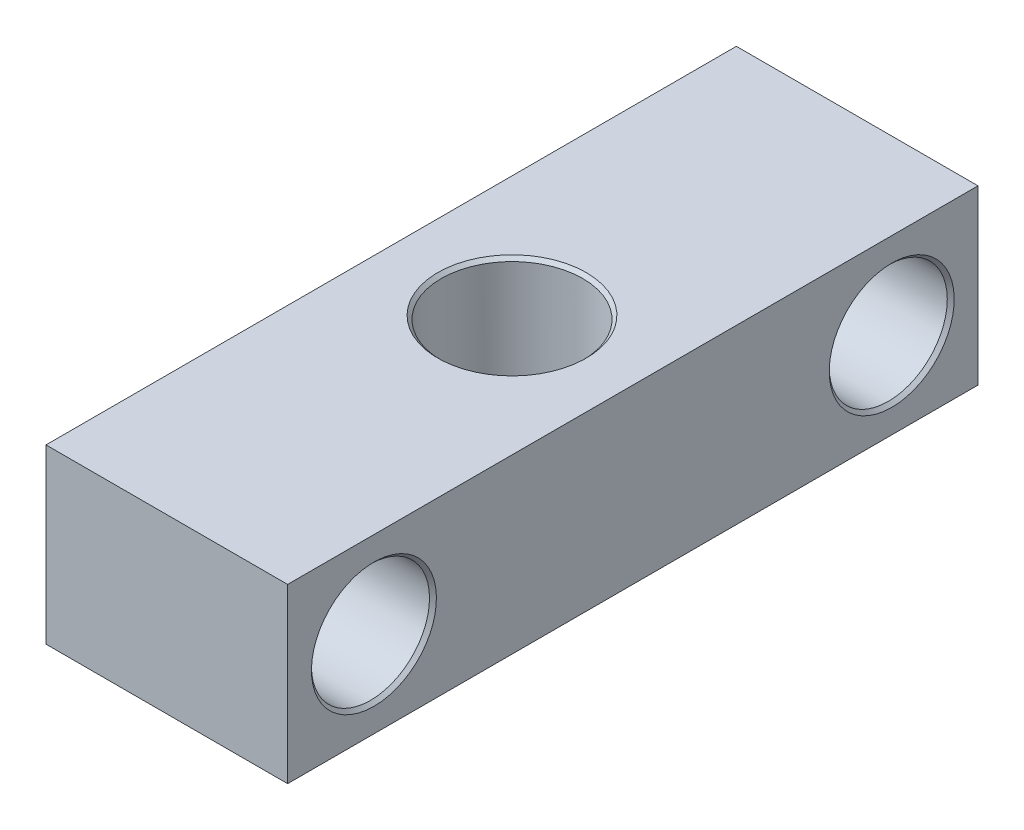
ISO-10303-21;
HEADER;
FILE_DESCRIPTION(('STEP AP214'),'2;1');
FILE_NAME('part.step','',(''),(''),'','','');
FILE_SCHEMA(('AUTOMOTIVE_DESIGN { 1 0 10303 214 1 1 1 1 }'));
ENDSEC;
DATA;
#1=APPLICATION_CONTEXT('core data for automotive mechanical design processes');
#2=APPLICATION_PROTOCOL_DEFINITION('international standard','automotive_design',2000,#1);
#3=PRODUCT_CONTEXT('',#1,'mechanical');
#4=PRODUCT('Part','Part','',(#3));
#5=PRODUCT_RELATED_PRODUCT_CATEGORY('part','',(#4));
#6=PRODUCT_DEFINITION_FORMATION('','',#4);
#7=PRODUCT_DEFINITION_CONTEXT('part definition',#1,'design');
#8=PRODUCT_DEFINITION('design','',#6,#7);
#9=PRODUCT_DEFINITION_SHAPE('','',#8);
#10=(LENGTH_UNIT() NAMED_UNIT(*) SI_UNIT(.MILLI.,.METRE.));
#11=(NAMED_UNIT(*) PLANE_ANGLE_UNIT() SI_UNIT($,.RADIAN.));
#12=(NAMED_UNIT(*) SI_UNIT($,.STERADIAN.) SOLID_ANGLE_UNIT());
#13=UNCERTAINTY_MEASURE_WITH_UNIT(LENGTH_MEASURE(1.E-05),#10,'distance_accuracy_value','');
#14=(GEOMETRIC_REPRESENTATION_CONTEXT(3) GLOBAL_UNCERTAINTY_ASSIGNED_CONTEXT((#13)) GLOBAL_UNIT_ASSIGNED_CONTEXT((#10,
#11,#12)) REPRESENTATION_CONTEXT('',''));
#15=CARTESIAN_POINT('',(0.,0.,0.));
#16=DIRECTION('',(0.,0.,1.));
#17=DIRECTION('',(1.,0.,0.));
#18=AXIS2_PLACEMENT_3D('',#15,#16,#17);
#19=CARTESIAN_POINT('',(17.5,12.5,50.));
#20=DIRECTION('',(-1.,0.,0.));
#21=DIRECTION('',(0.,-1.,0.));
#22=AXIS2_PLACEMENT_3D('',#19,#20,#21);
#23=PLANE('',#22);
#24=CARTESIAN_POINT('',(17.5,0.,-37.5));
#25=DIRECTION('',(-1.,0.,0.));
#26=DIRECTION('',(0.,-1.,0.));
#27=AXIS2_PLACEMENT_3D('',#24,#25,#26);
#28=CIRCLE('',#27,9.05000000000002);
#29=CARTESIAN_POINT('',(17.5,-9.05000000000001,-37.5));
#30=VERTEX_POINT('',#29);
#31=EDGE_CURVE('E13',#30,#30,#28,.T.);
#32=ORIENTED_EDGE('',*,*,#31,.T.);
#33=EDGE_LOOP('',(#32));
#34=FACE_BOUND('',#33,.T.);
#35=CARTESIAN_POINT('',(17.5,0.,37.5));
#36=DIRECTION('',(-1.,0.,0.));
#37=DIRECTION('',(0.,-1.,0.));
#38=AXIS2_PLACEMENT_3D('',#35,#36,#37);
#39=CIRCLE('',#38,9.05000000000002);
#40=CARTESIAN_POINT('',(17.5,-9.05000000000002,37.5));
#41=VERTEX_POINT('',#40);
#42=EDGE_CURVE('E56',#41,#41,#39,.T.);
#43=ORIENTED_EDGE('',*,*,#42,.T.);
#44=EDGE_LOOP('',(#43));
#45=FACE_BOUND('',#44,.T.);
#46=DIRECTION('',(0.,1.,0.));
#47=VECTOR('',#46,1.);
#48=CARTESIAN_POINT('',(17.5,12.5,-50.));
#49=LINE('',#48,#47);
#50=CARTESIAN_POINT('',(17.5,-12.5,-50.));
#51=VERTEX_POINT('',#50);
#52=CARTESIAN_POINT('',(17.5,12.5,-50.));
#53=VERTEX_POINT('',#52);
#54=EDGE_CURVE('E115',#51,#53,#49,.T.);
#55=ORIENTED_EDGE('',*,*,#54,.T.);
#56=DIRECTION('',(0.,0.,-1.));
#57=VECTOR('',#56,1.);
#58=CARTESIAN_POINT('',(17.5,12.5,50.));
#59=LINE('',#58,#57);
#60=CARTESIAN_POINT('',(17.5,12.5,50.));
#61=VERTEX_POINT('',#60);
#62=EDGE_CURVE('E106',#61,#53,#59,.T.);
#63=ORIENTED_EDGE('',*,*,#62,.F.);
#64=DIRECTION('',(0.,1.,0.));
#65=VECTOR('',#64,1.);
#66=CARTESIAN_POINT('',(17.5,12.5,50.));
#67=LINE('',#66,#65);
#68=CARTESIAN_POINT('',(17.5,-12.5,50.));
#69=VERTEX_POINT('',#68);
#70=EDGE_CURVE('E100',#69,#61,#67,.T.);
#71=ORIENTED_EDGE('',*,*,#70,.F.);
#72=DIRECTION('',(0.,0.,-1.));
#73=VECTOR('',#72,1.);
#74=CARTESIAN_POINT('',(17.5,-12.5,50.));
#75=LINE('',#74,#73);
#76=EDGE_CURVE('E111',#69,#51,#75,.T.);
#77=ORIENTED_EDGE('',*,*,#76,.T.);
#78=EDGE_LOOP('',(#55,#63,#71,#77));
#79=FACE_BOUND('',#78,.T.);
#80=ADVANCED_FACE('F47',(#34,#45,#79),#23,.F.);
#81=CARTESIAN_POINT('',(-17.5,12.5,50.));
#82=DIRECTION('',(0.,-1.,0.));
#83=DIRECTION('',(0.,0.,-1.));
#84=AXIS2_PLACEMENT_3D('',#81,#82,#83);
#85=PLANE('',#84);
#86=CARTESIAN_POINT('',(0.,12.5,0.));
#87=DIRECTION('',(0.,-1.,0.));
#88=DIRECTION('',(0.,0.,-1.));
#89=AXIS2_PLACEMENT_3D('',#86,#87,#88);
#90=CIRCLE('',#89,10.75);
#91=CARTESIAN_POINT('',(0.,12.5,-10.75));
#92=VERTEX_POINT('',#91);
#93=EDGE_CURVE('E148',#92,#92,#90,.T.);
#94=ORIENTED_EDGE('',*,*,#93,.T.);
#95=EDGE_LOOP('',(#94));
#96=FACE_BOUND('',#95,.T.);
#97=DIRECTION('',(-1.,0.,0.));
#98=VECTOR('',#97,1.);
#99=CARTESIAN_POINT('',(-17.5,12.5,-50.));
#100=LINE('',#99,#98);
#101=CARTESIAN_POINT('',(-17.5,12.5,-50.));
#102=VERTEX_POINT('',#101);
#103=EDGE_CURVE('E105',#53,#102,#100,.T.);
#104=ORIENTED_EDGE('',*,*,#103,.T.);
#105=DIRECTION('',(0.,0.,-1.));
#106=VECTOR('',#105,1.);
#107=CARTESIAN_POINT('',(-17.5,12.5,50.));
#108=LINE('',#107,#106);
#109=CARTESIAN_POINT('',(-17.5,12.5,50.));
#110=VERTEX_POINT('',#109);
#111=EDGE_CURVE('E103',#110,#102,#108,.T.);
#112=ORIENTED_EDGE('',*,*,#111,.F.);
#113=DIRECTION('',(-1.,0.,0.));
#114=VECTOR('',#113,1.);
#115=CARTESIAN_POINT('',(-17.5,12.5,50.));
#116=LINE('',#115,#114);
#117=EDGE_CURVE('E95',#61,#110,#116,.T.);
#118=ORIENTED_EDGE('',*,*,#117,.F.);
#119=ORIENTED_EDGE('',*,*,#62,.T.);
#120=EDGE_LOOP('',(#104,#112,#118,#119));
#121=FACE_BOUND('',#120,.T.);
#122=ADVANCED_FACE('F104',(#96,#121),#85,.F.);
#123=CARTESIAN_POINT('',(-17.5,12.5,50.));
#124=DIRECTION('',(1.,0.,0.));
#125=DIRECTION('',(0.,1.,0.));
#126=AXIS2_PLACEMENT_3D('',#123,#124,#125);
#127=PLANE('',#126);
#128=CARTESIAN_POINT('',(-17.5,0.,-37.5));
#129=DIRECTION('',(1.,0.,0.));
#130=DIRECTION('',(0.,1.,0.));
#131=AXIS2_PLACEMENT_3D('',#128,#129,#130);
#132=CIRCLE('',#131,9.05000000000001);
#133=CARTESIAN_POINT('',(-17.5,9.05000000000001,-37.5));
#134=VERTEX_POINT('',#133);
#135=EDGE_CURVE('E127',#134,#134,#132,.T.);
#136=ORIENTED_EDGE('',*,*,#135,.T.);
#137=EDGE_LOOP('',(#136));
#138=FACE_BOUND('',#137,.T.);
#139=CARTESIAN_POINT('',(-17.5,0.,37.5));
#140=DIRECTION('',(1.,0.,0.));
#141=DIRECTION('',(0.,1.,0.));
#142=AXIS2_PLACEMENT_3D('',#139,#140,#141);
#143=CIRCLE('',#142,9.05000000000001);
#144=CARTESIAN_POINT('',(-17.5,9.05000000000001,37.5));
#145=VERTEX_POINT('',#144);
#146=EDGE_CURVE('E124',#145,#145,#143,.T.);
#147=ORIENTED_EDGE('',*,*,#146,.T.);
#148=EDGE_LOOP('',(#147));
#149=FACE_BOUND('',#148,.T.);
#150=DIRECTION('',(0.,-1.,0.));
#151=VECTOR('',#150,1.);
#152=CARTESIAN_POINT('',(-17.5,12.5,-50.));
#153=LINE('',#152,#151);
#154=CARTESIAN_POINT('',(-17.5,-12.5,-50.));
#155=VERTEX_POINT('',#154);
#156=EDGE_CURVE('E81',#102,#155,#153,.T.);
#157=ORIENTED_EDGE('',*,*,#156,.T.);
#158=DIRECTION('',(0.,0.,-1.));
#159=VECTOR('',#158,1.);
#160=CARTESIAN_POINT('',(-17.5,-12.5,50.));
#161=LINE('',#160,#159);
#162=CARTESIAN_POINT('',(-17.5,-12.5,50.));
#163=VERTEX_POINT('',#162);
#164=EDGE_CURVE('E107',#163,#155,#161,.T.);
#165=ORIENTED_EDGE('',*,*,#164,.F.);
#166=DIRECTION('',(0.,-1.,0.));
#167=VECTOR('',#166,1.);
#168=CARTESIAN_POINT('',(-17.5,12.5,50.));
#169=LINE('',#168,#167);
#170=EDGE_CURVE('E98',#110,#163,#169,.T.);
#171=ORIENTED_EDGE('',*,*,#170,.F.);
#172=ORIENTED_EDGE('',*,*,#111,.T.);
#173=EDGE_LOOP('',(#157,#165,#171,#172));
#174=FACE_BOUND('',#173,.T.);
#175=ADVANCED_FACE('F109',(#138,#149,#174),#127,.F.);
#176=CARTESIAN_POINT('',(-17.5,-12.5,50.));
#177=DIRECTION('',(0.,1.,0.));
#178=DIRECTION('',(0.,0.,1.));
#179=AXIS2_PLACEMENT_3D('',#176,#177,#178);
#180=PLANE('',#179);
#181=CARTESIAN_POINT('',(0.,-12.5,0.));
#182=DIRECTION('',(0.,1.,0.));
#183=DIRECTION('',(0.,0.,1.));
#184=AXIS2_PLACEMENT_3D('',#181,#182,#183);
#185=CIRCLE('',#184,10.75);
#186=CARTESIAN_POINT('',(0.,-12.5,10.75));
#187=VERTEX_POINT('',#186);
#188=EDGE_CURVE('E151',#187,#187,#185,.T.);
#189=ORIENTED_EDGE('',*,*,#188,.T.);
#190=EDGE_LOOP('',(#189));
#191=FACE_BOUND('',#190,.T.);
#192=DIRECTION('',(1.,0.,0.));
#193=VECTOR('',#192,1.);
#194=CARTESIAN_POINT('',(-17.5,-12.5,-50.));
#195=LINE('',#194,#193);
#196=EDGE_CURVE('E87',#155,#51,#195,.T.);
#197=ORIENTED_EDGE('',*,*,#196,.T.);
#198=ORIENTED_EDGE('',*,*,#76,.F.);
#199=DIRECTION('',(1.,0.,0.));
#200=VECTOR('',#199,1.);
#201=CARTESIAN_POINT('',(-17.5,-12.5,50.));
#202=LINE('',#201,#200);
#203=EDGE_CURVE('E64',#163,#69,#202,.T.);
#204=ORIENTED_EDGE('',*,*,#203,.F.);
#205=ORIENTED_EDGE('',*,*,#164,.T.);
#206=EDGE_LOOP('',(#197,#198,#204,#205));
#207=FACE_BOUND('',#206,.T.);
#208=ADVANCED_FACE('F255',(#191,#207),#180,.F.);
#209=CARTESIAN_POINT('',(0.,0.,50.));
#210=DIRECTION('',(0.,0.,1.));
#211=DIRECTION('',(1.,0.,0.));
#212=AXIS2_PLACEMENT_3D('',#209,#210,#211);
#213=PLANE('',#212);
#214=ORIENTED_EDGE('',*,*,#70,.T.);
#215=ORIENTED_EDGE('',*,*,#117,.T.);
#216=ORIENTED_EDGE('',*,*,#170,.T.);
#217=ORIENTED_EDGE('',*,*,#203,.T.);
#218=EDGE_LOOP('',(#214,#215,#216,#217));
#219=FACE_BOUND('',#218,.T.);
#220=ADVANCED_FACE('F96',(#219),#213,.T.);
#221=CARTESIAN_POINT('',(0.,0.,-50.));
#222=DIRECTION('',(0.,0.,1.));
#223=DIRECTION('',(1.,0.,0.));
#224=AXIS2_PLACEMENT_3D('',#221,#222,#223);
#225=PLANE('',#224);
#226=ORIENTED_EDGE('',*,*,#54,.F.);
#227=ORIENTED_EDGE('',*,*,#196,.F.);
#228=ORIENTED_EDGE('',*,*,#156,.F.);
#229=ORIENTED_EDGE('',*,*,#103,.F.);
#230=EDGE_LOOP('',(#226,#227,#228,#229));
#231=FACE_BOUND('',#230,.T.);
#232=ADVANCED_FACE('F240',(#231),#225,.F.);
#233=CARTESIAN_POINT('',(0.,-87.5,0.));
#234=DIRECTION('',(0.,1.,0.));
#235=DIRECTION('',(0.,0.,1.));
#236=AXIS2_PLACEMENT_3D('',#233,#234,#235);
#237=CYLINDRICAL_SURFACE('',#236,10.25);
#238=CARTESIAN_POINT('',(0.,12.,0.));
#239=DIRECTION('',(0.,-1.,0.));
#240=DIRECTION('',(0.,0.,-1.));
#241=AXIS2_PLACEMENT_3D('',#238,#239,#240);
#242=CIRCLE('',#241,10.25);
#243=CARTESIAN_POINT('',(0.,12.,-10.25));
#244=VERTEX_POINT('',#243);
#245=EDGE_CURVE('E145',#244,#244,#242,.F.);
#246=ORIENTED_EDGE('',*,*,#245,.T.);
#247=EDGE_LOOP('',(#246));
#248=FACE_BOUND('',#247,.T.);
#249=CARTESIAN_POINT('',(0.,-12.,0.));
#250=DIRECTION('',(0.,1.,0.));
#251=DIRECTION('',(0.,0.,1.));
#252=AXIS2_PLACEMENT_3D('',#249,#250,#251);
#253=CIRCLE('',#252,10.25);
#254=CARTESIAN_POINT('',(0.,-12.,10.25));
#255=VERTEX_POINT('',#254);
#256=EDGE_CURVE('E142',#255,#255,#253,.F.);
#257=ORIENTED_EDGE('',*,*,#256,.T.);
#258=EDGE_LOOP('',(#257));
#259=FACE_BOUND('',#258,.T.);
#260=ADVANCED_FACE('F176',(#248,#259),#237,.F.);
#261=CARTESIAN_POINT('',(-17.5,0.,-37.5));
#262=DIRECTION('',(1.,0.,0.));
#263=DIRECTION('',(0.,1.,0.));
#264=AXIS2_PLACEMENT_3D('',#261,#262,#263);
#265=CYLINDRICAL_SURFACE('',#264,8.55);
#266=CARTESIAN_POINT('',(-17.,0.,-37.5));
#267=DIRECTION('',(1.,0.,0.));
#268=DIRECTION('',(0.,1.,0.));
#269=AXIS2_PLACEMENT_3D('',#266,#267,#268);
#270=CIRCLE('',#269,8.55);
#271=CARTESIAN_POINT('',(-17.,8.55,-37.5));
#272=VERTEX_POINT('',#271);
#273=EDGE_CURVE('E133',#272,#272,#270,.F.);
#274=ORIENTED_EDGE('',*,*,#273,.T.);
#275=EDGE_LOOP('',(#274));
#276=FACE_BOUND('',#275,.T.);
#277=CARTESIAN_POINT('',(17.,0.,-37.5));
#278=DIRECTION('',(-1.,0.,0.));
#279=DIRECTION('',(0.,-1.,0.));
#280=AXIS2_PLACEMENT_3D('',#277,#278,#279);
#281=CIRCLE('',#280,8.55);
#282=CARTESIAN_POINT('',(17.,-8.55,-37.5));
#283=VERTEX_POINT('',#282);
#284=EDGE_CURVE('E130',#283,#283,#281,.F.);
#285=ORIENTED_EDGE('',*,*,#284,.T.);
#286=EDGE_LOOP('',(#285));
#287=FACE_BOUND('',#286,.T.);
#288=ADVANCED_FACE('F166',(#276,#287),#265,.F.);
#289=CARTESIAN_POINT('',(-17.5,0.,37.5));
#290=DIRECTION('',(1.,0.,0.));
#291=DIRECTION('',(0.,1.,0.));
#292=AXIS2_PLACEMENT_3D('',#289,#290,#291);
#293=CYLINDRICAL_SURFACE('',#292,8.55);
#294=CARTESIAN_POINT('',(-17.,0.,37.5));
#295=DIRECTION('',(1.,0.,0.));
#296=DIRECTION('',(0.,1.,0.));
#297=AXIS2_PLACEMENT_3D('',#294,#295,#296);
#298=CIRCLE('',#297,8.55);
#299=CARTESIAN_POINT('',(-17.,8.55,37.5));
#300=VERTEX_POINT('',#299);
#301=EDGE_CURVE('E139',#300,#300,#298,.F.);
#302=ORIENTED_EDGE('',*,*,#301,.T.);
#303=EDGE_LOOP('',(#302));
#304=FACE_BOUND('',#303,.T.);
#305=CARTESIAN_POINT('',(17.,0.,37.5));
#306=DIRECTION('',(-1.,0.,0.));
#307=DIRECTION('',(0.,-1.,0.));
#308=AXIS2_PLACEMENT_3D('',#305,#306,#307);
#309=CIRCLE('',#308,8.55);
#310=CARTESIAN_POINT('',(17.,-8.55,37.5));
#311=VERTEX_POINT('',#310);
#312=EDGE_CURVE('E136',#311,#311,#309,.F.);
#313=ORIENTED_EDGE('',*,*,#312,.T.);
#314=EDGE_LOOP('',(#313));
#315=FACE_BOUND('',#314,.T.);
#316=ADVANCED_FACE('F163',(#304,#315),#293,.F.);
#317=CARTESIAN_POINT('',(-17.5,0.,-37.5));
#318=DIRECTION('',(-1.,0.,0.));
#319=DIRECTION('',(0.,-1.,0.));
#320=AXIS2_PLACEMENT_3D('',#317,#318,#319);
#321=CONICAL_SURFACE('',#320,9.05000000000001,0.785398163397447);
#322=ORIENTED_EDGE('',*,*,#273,.F.);
#323=EDGE_LOOP('',(#322));
#324=FACE_BOUND('',#323,.T.);
#325=ORIENTED_EDGE('',*,*,#135,.F.);
#326=EDGE_LOOP('',(#325));
#327=FACE_BOUND('',#326,.T.);
#328=ADVANCED_FACE('F165',(#324,#327),#321,.F.);
#329=CARTESIAN_POINT('',(-17.5,0.,37.5));
#330=DIRECTION('',(-1.,0.,0.));
#331=DIRECTION('',(0.,-1.,0.));
#332=AXIS2_PLACEMENT_3D('',#329,#330,#331);
#333=CONICAL_SURFACE('',#332,9.05000000000001,0.785398163397447);
#334=ORIENTED_EDGE('',*,*,#301,.F.);
#335=EDGE_LOOP('',(#334));
#336=FACE_BOUND('',#335,.T.);
#337=ORIENTED_EDGE('',*,*,#146,.F.);
#338=EDGE_LOOP('',(#337));
#339=FACE_BOUND('',#338,.T.);
#340=ADVANCED_FACE('F173',(#336,#339),#333,.F.);
#341=CARTESIAN_POINT('',(0.,12.,0.));
#342=DIRECTION('',(0.,1.,0.));
#343=DIRECTION('',(0.,0.,1.));
#344=AXIS2_PLACEMENT_3D('',#341,#342,#343);
#345=CONICAL_SURFACE('',#344,10.25,0.785398163397457);
#346=ORIENTED_EDGE('',*,*,#93,.F.);
#347=EDGE_LOOP('',(#346));
#348=FACE_BOUND('',#347,.T.);
#349=ORIENTED_EDGE('',*,*,#245,.F.);
#350=EDGE_LOOP('',(#349));
#351=FACE_BOUND('',#350,.T.);
#352=ADVANCED_FACE('F191',(#348,#351),#345,.F.);
#353=CARTESIAN_POINT('',(0.,-12.5,0.));
#354=DIRECTION('',(0.,-1.,0.));
#355=DIRECTION('',(0.,0.,-1.));
#356=AXIS2_PLACEMENT_3D('',#353,#354,#355);
#357=CONICAL_SURFACE('',#356,10.75,0.785398163397457);
#358=ORIENTED_EDGE('',*,*,#256,.F.);
#359=EDGE_LOOP('',(#358));
#360=FACE_BOUND('',#359,.T.);
#361=ORIENTED_EDGE('',*,*,#188,.F.);
#362=EDGE_LOOP('',(#361));
#363=FACE_BOUND('',#362,.T.);
#364=ADVANCED_FACE('F195',(#360,#363),#357,.F.);
#365=CARTESIAN_POINT('',(17.,0.,-37.5));
#366=DIRECTION('',(1.,0.,0.));
#367=DIRECTION('',(0.,1.,0.));
#368=AXIS2_PLACEMENT_3D('',#365,#366,#367);
#369=CONICAL_SURFACE('',#368,8.55,0.78539816339746);
#370=ORIENTED_EDGE('',*,*,#31,.F.);
#371=EDGE_LOOP('',(#370));
#372=FACE_BOUND('',#371,.T.);
#373=ORIENTED_EDGE('',*,*,#284,.F.);
#374=EDGE_LOOP('',(#373));
#375=FACE_BOUND('',#374,.T.);
#376=ADVANCED_FACE('F160',(#372,#375),#369,.F.);
#377=CARTESIAN_POINT('',(17.,0.,37.5));
#378=DIRECTION('',(1.,0.,0.));
#379=DIRECTION('',(0.,1.,0.));
#380=AXIS2_PLACEMENT_3D('',#377,#378,#379);
#381=CONICAL_SURFACE('',#380,8.55,0.78539816339746);
#382=ORIENTED_EDGE('',*,*,#42,.F.);
#383=EDGE_LOOP('',(#382));
#384=FACE_BOUND('',#383,.T.);
#385=ORIENTED_EDGE('',*,*,#312,.F.);
#386=EDGE_LOOP('',(#385));
#387=FACE_BOUND('',#386,.T.);
#388=ADVANCED_FACE('F49',(#384,#387),#381,.F.);
#389=CLOSED_SHELL('',(#80,#122,#175,#208,#220,#232,#260,#288,#316,#328,#340,#352,#364,#376,#388));
#390=MANIFOLD_SOLID_BREP('B2',#389);
#391=ADVANCED_BREP_SHAPE_REPRESENTATION('',(#18,#390),#14);
#392=SHAPE_DEFINITION_REPRESENTATION(#9,#391);
ENDSEC;
END-ISO-10303-21;
